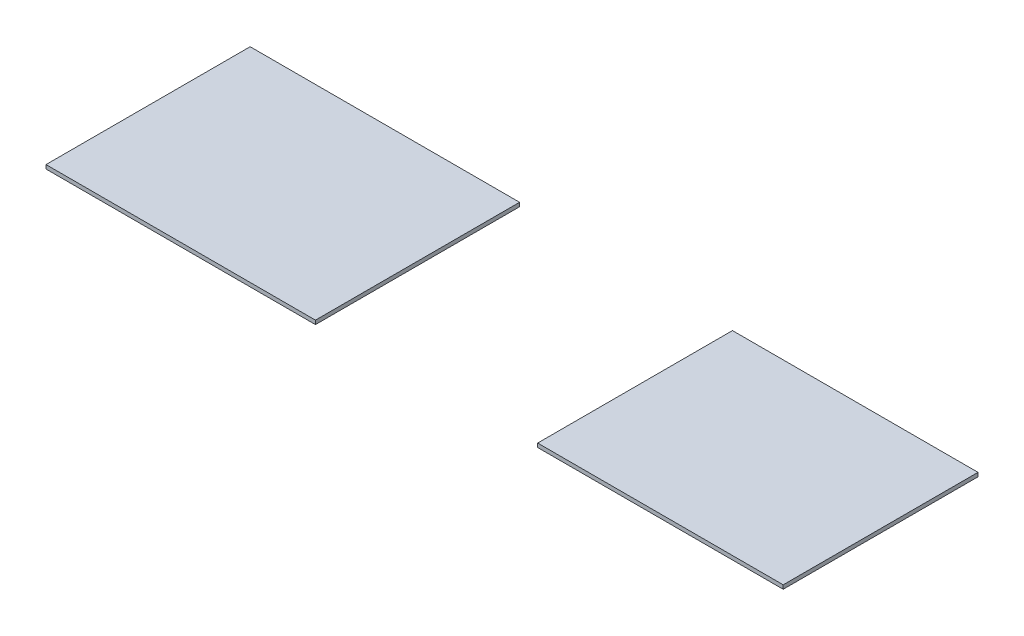
ISO-10303-21;
HEADER;
FILE_DESCRIPTION(('STEP AP214'),'2;1');
FILE_NAME('part.step','',(''),(''),'','','');
FILE_SCHEMA(('AUTOMOTIVE_DESIGN { 1 0 10303 214 1 1 1 1 }'));
ENDSEC;
DATA;
#1=APPLICATION_CONTEXT('core data for automotive mechanical design processes');
#2=APPLICATION_PROTOCOL_DEFINITION('international standard','automotive_design',2000,#1);
#3=PRODUCT_CONTEXT('',#1,'mechanical');
#4=PRODUCT('Part','Part','',(#3));
#5=PRODUCT_RELATED_PRODUCT_CATEGORY('part','',(#4));
#6=PRODUCT_DEFINITION_FORMATION('','',#4);
#7=PRODUCT_DEFINITION_CONTEXT('part definition',#1,'design');
#8=PRODUCT_DEFINITION('design','',#6,#7);
#9=PRODUCT_DEFINITION_SHAPE('','',#8);
#10=(LENGTH_UNIT() NAMED_UNIT(*) SI_UNIT(.MILLI.,.METRE.));
#11=(NAMED_UNIT(*) PLANE_ANGLE_UNIT() SI_UNIT($,.RADIAN.));
#12=(NAMED_UNIT(*) SI_UNIT($,.STERADIAN.) SOLID_ANGLE_UNIT());
#13=UNCERTAINTY_MEASURE_WITH_UNIT(LENGTH_MEASURE(1.E-05),#10,'distance_accuracy_value','');
#14=(GEOMETRIC_REPRESENTATION_CONTEXT(3) GLOBAL_UNCERTAINTY_ASSIGNED_CONTEXT((#13)) GLOBAL_UNIT_ASSIGNED_CONTEXT((#10,
#11,#12)) REPRESENTATION_CONTEXT('',''));
#15=CARTESIAN_POINT('',(0.,0.,0.));
#16=DIRECTION('',(0.,0.,1.));
#17=DIRECTION('',(1.,0.,0.));
#18=AXIS2_PLACEMENT_3D('',#15,#16,#17);
#19=CARTESIAN_POINT('',(-237.003922581289,6.35,30.4903935562101));
#20=DIRECTION('',(-1.,0.,0.));
#21=DIRECTION('',(0.,0.,1.));
#22=AXIS2_PLACEMENT_3D('',#19,#20,#21);
#23=PLANE('',#22);
#24=DIRECTION('',(0.,0.,-1.));
#25=VECTOR('',#24,1.);
#26=CARTESIAN_POINT('',(-237.003922581289,0.,30.4903935562101));
#27=LINE('',#26,#25);
#28=CARTESIAN_POINT('',(-237.003922581289,0.,30.4903935562101));
#29=VERTEX_POINT('',#28);
#30=CARTESIAN_POINT('',(-237.003922581289,0.,-302.998285964837));
#31=VERTEX_POINT('',#30);
#32=EDGE_CURVE('E107',#29,#31,#27,.T.);
#33=ORIENTED_EDGE('',*,*,#32,.T.);
#34=DIRECTION('',(0.,-1.,0.));
#35=VECTOR('',#34,1.);
#36=CARTESIAN_POINT('',(-237.003922581289,6.35,-302.998285964837));
#37=LINE('',#36,#35);
#38=CARTESIAN_POINT('',(-237.003922581289,6.35,-302.998285964837));
#39=VERTEX_POINT('',#38);
#40=EDGE_CURVE('E12',#39,#31,#37,.T.);
#41=ORIENTED_EDGE('',*,*,#40,.F.);
#42=DIRECTION('',(0.,0.,-1.));
#43=VECTOR('',#42,1.);
#44=CARTESIAN_POINT('',(-237.003922581289,6.35,30.4903935562101));
#45=LINE('',#44,#43);
#46=CARTESIAN_POINT('',(-237.003922581289,6.35,30.4903935562101));
#47=VERTEX_POINT('',#46);
#48=EDGE_CURVE('E95',#47,#39,#45,.T.);
#49=ORIENTED_EDGE('',*,*,#48,.F.);
#50=DIRECTION('',(0.,-1.,0.));
#51=VECTOR('',#50,1.);
#52=CARTESIAN_POINT('',(-237.003922581289,6.35,30.4903935562101));
#53=LINE('',#52,#51);
#54=EDGE_CURVE('E103',#47,#29,#53,.T.);
#55=ORIENTED_EDGE('',*,*,#54,.T.);
#56=EDGE_LOOP('',(#33,#41,#49,#55));
#57=FACE_BOUND('',#56,.T.);
#58=ADVANCED_FACE('F44',(#57),#23,.F.);
#59=CARTESIAN_POINT('',(-237.003922581289,6.35,-302.998285964837));
#60=DIRECTION('',(0.,0.,1.));
#61=DIRECTION('',(1.,0.,0.));
#62=AXIS2_PLACEMENT_3D('',#59,#60,#61);
#63=PLANE('',#62);
#64=DIRECTION('',(-1.,0.,0.));
#65=VECTOR('',#64,1.);
#66=CARTESIAN_POINT('',(-237.003922581289,0.,-302.998285964837));
#67=LINE('',#66,#65);
#68=CARTESIAN_POINT('',(-677.208979549072,0.,-302.998285964837));
#69=VERTEX_POINT('',#68);
#70=EDGE_CURVE('E99',#31,#69,#67,.T.);
#71=ORIENTED_EDGE('',*,*,#70,.T.);
#72=DIRECTION('',(0.,-1.,0.));
#73=VECTOR('',#72,1.);
#74=CARTESIAN_POINT('',(-677.208979549072,6.35,-302.998285964837));
#75=LINE('',#74,#73);
#76=CARTESIAN_POINT('',(-677.208979549072,6.35,-302.998285964837));
#77=VERTEX_POINT('',#76);
#78=EDGE_CURVE('E52',#77,#69,#75,.T.);
#79=ORIENTED_EDGE('',*,*,#78,.F.);
#80=DIRECTION('',(-1.,0.,0.));
#81=VECTOR('',#80,1.);
#82=CARTESIAN_POINT('',(-237.003922581289,6.35,-302.998285964837));
#83=LINE('',#82,#81);
#84=EDGE_CURVE('E90',#39,#77,#83,.T.);
#85=ORIENTED_EDGE('',*,*,#84,.F.);
#86=ORIENTED_EDGE('',*,*,#40,.T.);
#87=EDGE_LOOP('',(#71,#79,#85,#86));
#88=FACE_BOUND('',#87,.T.);
#89=ADVANCED_FACE('F98',(#88),#63,.F.);
#90=CARTESIAN_POINT('',(-677.208979549072,6.35,30.4903935562101));
#91=DIRECTION('',(1.,0.,0.));
#92=DIRECTION('',(0.,0.,-1.));
#93=AXIS2_PLACEMENT_3D('',#90,#91,#92);
#94=PLANE('',#93);
#95=DIRECTION('',(0.,0.,1.));
#96=VECTOR('',#95,1.);
#97=CARTESIAN_POINT('',(-677.208979549072,0.,30.4903935562101));
#98=LINE('',#97,#96);
#99=CARTESIAN_POINT('',(-677.208979549072,0.,30.4903935562101));
#100=VERTEX_POINT('',#99);
#101=EDGE_CURVE('E77',#69,#100,#98,.T.);
#102=ORIENTED_EDGE('',*,*,#101,.T.);
#103=DIRECTION('',(0.,-1.,0.));
#104=VECTOR('',#103,1.);
#105=CARTESIAN_POINT('',(-677.208979549072,6.35,30.4903935562101));
#106=LINE('',#105,#104);
#107=CARTESIAN_POINT('',(-677.208979549072,6.35,30.4903935562101));
#108=VERTEX_POINT('',#107);
#109=EDGE_CURVE('E100',#108,#100,#106,.T.);
#110=ORIENTED_EDGE('',*,*,#109,.F.);
#111=DIRECTION('',(0.,0.,1.));
#112=VECTOR('',#111,1.);
#113=CARTESIAN_POINT('',(-677.208979549072,6.35,30.4903935562101));
#114=LINE('',#113,#112);
#115=EDGE_CURVE('E93',#77,#108,#114,.T.);
#116=ORIENTED_EDGE('',*,*,#115,.F.);
#117=ORIENTED_EDGE('',*,*,#78,.T.);
#118=EDGE_LOOP('',(#102,#110,#116,#117));
#119=FACE_BOUND('',#118,.T.);
#120=ADVANCED_FACE('F101',(#119),#94,.F.);
#121=CARTESIAN_POINT('',(-237.003922581289,6.35,30.4903935562101));
#122=DIRECTION('',(0.,0.,-1.));
#123=DIRECTION('',(-1.,0.,0.));
#124=AXIS2_PLACEMENT_3D('',#121,#122,#123);
#125=PLANE('',#124);
#126=DIRECTION('',(1.,0.,0.));
#127=VECTOR('',#126,1.);
#128=CARTESIAN_POINT('',(-237.003922581289,0.,30.4903935562101));
#129=LINE('',#128,#127);
#130=EDGE_CURVE('E83',#100,#29,#129,.T.);
#131=ORIENTED_EDGE('',*,*,#130,.T.);
#132=ORIENTED_EDGE('',*,*,#54,.F.);
#133=DIRECTION('',(1.,0.,0.));
#134=VECTOR('',#133,1.);
#135=CARTESIAN_POINT('',(-237.003922581289,6.35,30.4903935562101));
#136=LINE('',#135,#134);
#137=EDGE_CURVE('E60',#108,#47,#136,.T.);
#138=ORIENTED_EDGE('',*,*,#137,.F.);
#139=ORIENTED_EDGE('',*,*,#109,.T.);
#140=EDGE_LOOP('',(#131,#132,#138,#139));
#141=FACE_BOUND('',#140,.T.);
#142=ADVANCED_FACE('F114',(#141),#125,.F.);
#143=CARTESIAN_POINT('',(0.,6.35,0.));
#144=DIRECTION('',(0.,1.,0.));
#145=DIRECTION('',(0.,0.,1.));
#146=AXIS2_PLACEMENT_3D('',#143,#144,#145);
#147=PLANE('',#146);
#148=ORIENTED_EDGE('',*,*,#48,.T.);
#149=ORIENTED_EDGE('',*,*,#84,.T.);
#150=ORIENTED_EDGE('',*,*,#115,.T.);
#151=ORIENTED_EDGE('',*,*,#137,.T.);
#152=EDGE_LOOP('',(#148,#149,#150,#151));
#153=FACE_BOUND('',#152,.T.);
#154=ADVANCED_FACE('F91',(#153),#147,.T.);
#155=CARTESIAN_POINT('',(0.,0.,0.));
#156=DIRECTION('',(0.,1.,0.));
#157=DIRECTION('',(0.,0.,1.));
#158=AXIS2_PLACEMENT_3D('',#155,#156,#157);
#159=PLANE('',#158);
#160=ORIENTED_EDGE('',*,*,#32,.F.);
#161=ORIENTED_EDGE('',*,*,#130,.F.);
#162=ORIENTED_EDGE('',*,*,#101,.F.);
#163=ORIENTED_EDGE('',*,*,#70,.F.);
#164=EDGE_LOOP('',(#160,#161,#162,#163));
#165=FACE_BOUND('',#164,.T.);
#166=ADVANCED_FACE('F117',(#165),#159,.F.);
#167=CLOSED_SHELL('',(#58,#89,#120,#142,#154,#166));
#168=MANIFOLD_SOLID_BREP('B2',#167);
#169=CARTESIAN_POINT('',(118.399727308284,6.35,22.8677951671575));
#170=DIRECTION('',(1.,0.,0.));
#171=DIRECTION('',(0.,0.,-1.));
#172=AXIS2_PLACEMENT_3D('',#169,#170,#171);
#173=PLANE('',#172);
#174=DIRECTION('',(0.,0.,1.));
#175=VECTOR('',#174,1.);
#176=CARTESIAN_POINT('',(118.399727308284,0.,22.8677951671575));
#177=LINE('',#176,#175);
#178=CARTESIAN_POINT('',(118.399727308284,0.,-295.375687575785));
#179=VERTEX_POINT('',#178);
#180=CARTESIAN_POINT('',(118.399727308284,0.,22.8677951671575));
#181=VERTEX_POINT('',#180);
#182=EDGE_CURVE('E230',#179,#181,#177,.T.);
#183=ORIENTED_EDGE('',*,*,#182,.T.);
#184=DIRECTION('',(0.,-1.,0.));
#185=VECTOR('',#184,1.);
#186=CARTESIAN_POINT('',(118.399727308284,6.35,22.8677951671575));
#187=LINE('',#186,#185);
#188=CARTESIAN_POINT('',(118.399727308284,6.35,22.8677951671575));
#189=VERTEX_POINT('',#188);
#190=EDGE_CURVE('E42',#189,#181,#187,.T.);
#191=ORIENTED_EDGE('',*,*,#190,.F.);
#192=DIRECTION('',(0.,0.,1.));
#193=VECTOR('',#192,1.);
#194=CARTESIAN_POINT('',(118.399727308284,6.35,22.8677951671575));
#195=LINE('',#194,#193);
#196=CARTESIAN_POINT('',(118.399727308284,6.35,-295.375687575785));
#197=VERTEX_POINT('',#196);
#198=EDGE_CURVE('E218',#197,#189,#195,.T.);
#199=ORIENTED_EDGE('',*,*,#198,.F.);
#200=DIRECTION('',(0.,-1.,0.));
#201=VECTOR('',#200,1.);
#202=CARTESIAN_POINT('',(118.399727308284,6.35,-295.375687575785));
#203=LINE('',#202,#201);
#204=EDGE_CURVE('E226',#197,#179,#203,.T.);
#205=ORIENTED_EDGE('',*,*,#204,.T.);
#206=EDGE_LOOP('',(#183,#191,#199,#205));
#207=FACE_BOUND('',#206,.T.);
#208=ADVANCED_FACE('F167',(#207),#173,.F.);
#209=CARTESIAN_POINT('',(118.399727308284,6.35,22.8677951671575));
#210=DIRECTION('',(0.,0.,-1.));
#211=DIRECTION('',(-1.,0.,0.));
#212=AXIS2_PLACEMENT_3D('',#209,#210,#211);
#213=PLANE('',#212);
#214=DIRECTION('',(1.,0.,0.));
#215=VECTOR('',#214,1.);
#216=CARTESIAN_POINT('',(118.399727308284,0.,22.8677951671575));
#217=LINE('',#216,#215);
#218=CARTESIAN_POINT('',(519.538967532172,0.,22.8677951671575));
#219=VERTEX_POINT('',#218);
#220=EDGE_CURVE('E222',#181,#219,#217,.T.);
#221=ORIENTED_EDGE('',*,*,#220,.T.);
#222=DIRECTION('',(0.,-1.,0.));
#223=VECTOR('',#222,1.);
#224=CARTESIAN_POINT('',(519.538967532172,6.35,22.8677951671575));
#225=LINE('',#224,#223);
#226=CARTESIAN_POINT('',(519.538967532172,6.35,22.8677951671575));
#227=VERTEX_POINT('',#226);
#228=EDGE_CURVE('E175',#227,#219,#225,.T.);
#229=ORIENTED_EDGE('',*,*,#228,.F.);
#230=DIRECTION('',(1.,0.,0.));
#231=VECTOR('',#230,1.);
#232=CARTESIAN_POINT('',(118.399727308284,6.35,22.8677951671575));
#233=LINE('',#232,#231);
#234=EDGE_CURVE('E213',#189,#227,#233,.T.);
#235=ORIENTED_EDGE('',*,*,#234,.F.);
#236=ORIENTED_EDGE('',*,*,#190,.T.);
#237=EDGE_LOOP('',(#221,#229,#235,#236));
#238=FACE_BOUND('',#237,.T.);
#239=ADVANCED_FACE('F221',(#238),#213,.F.);
#240=CARTESIAN_POINT('',(519.538967532172,6.35,22.8677951671575));
#241=DIRECTION('',(-1.,0.,0.));
#242=DIRECTION('',(0.,0.,1.));
#243=AXIS2_PLACEMENT_3D('',#240,#241,#242);
#244=PLANE('',#243);
#245=DIRECTION('',(0.,0.,-1.));
#246=VECTOR('',#245,1.);
#247=CARTESIAN_POINT('',(519.538967532172,0.,22.8677951671575));
#248=LINE('',#247,#246);
#249=CARTESIAN_POINT('',(519.538967532172,0.,-295.375687575785));
#250=VERTEX_POINT('',#249);
#251=EDGE_CURVE('E200',#219,#250,#248,.T.);
#252=ORIENTED_EDGE('',*,*,#251,.T.);
#253=DIRECTION('',(0.,-1.,0.));
#254=VECTOR('',#253,1.);
#255=CARTESIAN_POINT('',(519.538967532172,6.35,-295.375687575785));
#256=LINE('',#255,#254);
#257=CARTESIAN_POINT('',(519.538967532172,6.35,-295.375687575785));
#258=VERTEX_POINT('',#257);
#259=EDGE_CURVE('E223',#258,#250,#256,.T.);
#260=ORIENTED_EDGE('',*,*,#259,.F.);
#261=DIRECTION('',(0.,0.,-1.));
#262=VECTOR('',#261,1.);
#263=CARTESIAN_POINT('',(519.538967532172,6.35,22.8677951671575));
#264=LINE('',#263,#262);
#265=EDGE_CURVE('E216',#227,#258,#264,.T.);
#266=ORIENTED_EDGE('',*,*,#265,.F.);
#267=ORIENTED_EDGE('',*,*,#228,.T.);
#268=EDGE_LOOP('',(#252,#260,#266,#267));
#269=FACE_BOUND('',#268,.T.);
#270=ADVANCED_FACE('F224',(#269),#244,.F.);
#271=CARTESIAN_POINT('',(118.399727308284,6.35,-295.375687575785));
#272=DIRECTION('',(0.,0.,1.));
#273=DIRECTION('',(1.,0.,0.));
#274=AXIS2_PLACEMENT_3D('',#271,#272,#273);
#275=PLANE('',#274);
#276=DIRECTION('',(-1.,0.,0.));
#277=VECTOR('',#276,1.);
#278=CARTESIAN_POINT('',(118.399727308284,0.,-295.375687575785));
#279=LINE('',#278,#277);
#280=EDGE_CURVE('E206',#250,#179,#279,.T.);
#281=ORIENTED_EDGE('',*,*,#280,.T.);
#282=ORIENTED_EDGE('',*,*,#204,.F.);
#283=DIRECTION('',(-1.,0.,0.));
#284=VECTOR('',#283,1.);
#285=CARTESIAN_POINT('',(118.399727308284,6.35,-295.375687575785));
#286=LINE('',#285,#284);
#287=EDGE_CURVE('E183',#258,#197,#286,.T.);
#288=ORIENTED_EDGE('',*,*,#287,.F.);
#289=ORIENTED_EDGE('',*,*,#259,.T.);
#290=EDGE_LOOP('',(#281,#282,#288,#289));
#291=FACE_BOUND('',#290,.T.);
#292=ADVANCED_FACE('F237',(#291),#275,.F.);
#293=CARTESIAN_POINT('',(0.,6.35,0.));
#294=DIRECTION('',(0.,-1.,0.));
#295=DIRECTION('',(0.,0.,-1.));
#296=AXIS2_PLACEMENT_3D('',#293,#294,#295);
#297=PLANE('',#296);
#298=ORIENTED_EDGE('',*,*,#198,.T.);
#299=ORIENTED_EDGE('',*,*,#234,.T.);
#300=ORIENTED_EDGE('',*,*,#265,.T.);
#301=ORIENTED_EDGE('',*,*,#287,.T.);
#302=EDGE_LOOP('',(#298,#299,#300,#301));
#303=FACE_BOUND('',#302,.T.);
#304=ADVANCED_FACE('F214',(#303),#297,.F.);
#305=CARTESIAN_POINT('',(0.,0.,0.));
#306=DIRECTION('',(0.,-1.,0.));
#307=DIRECTION('',(0.,0.,-1.));
#308=AXIS2_PLACEMENT_3D('',#305,#306,#307);
#309=PLANE('',#308);
#310=ORIENTED_EDGE('',*,*,#182,.F.);
#311=ORIENTED_EDGE('',*,*,#280,.F.);
#312=ORIENTED_EDGE('',*,*,#251,.F.);
#313=ORIENTED_EDGE('',*,*,#220,.F.);
#314=EDGE_LOOP('',(#310,#311,#312,#313));
#315=FACE_BOUND('',#314,.T.);
#316=ADVANCED_FACE('F240',(#315),#309,.T.);
#317=CLOSED_SHELL('',(#208,#239,#270,#292,#304,#316));
#318=MANIFOLD_SOLID_BREP('B6',#317);
#319=ADVANCED_BREP_SHAPE_REPRESENTATION('',(#18,#168,#318),#14);
#320=SHAPE_DEFINITION_REPRESENTATION(#9,#319);
ENDSEC;
END-ISO-10303-21;
